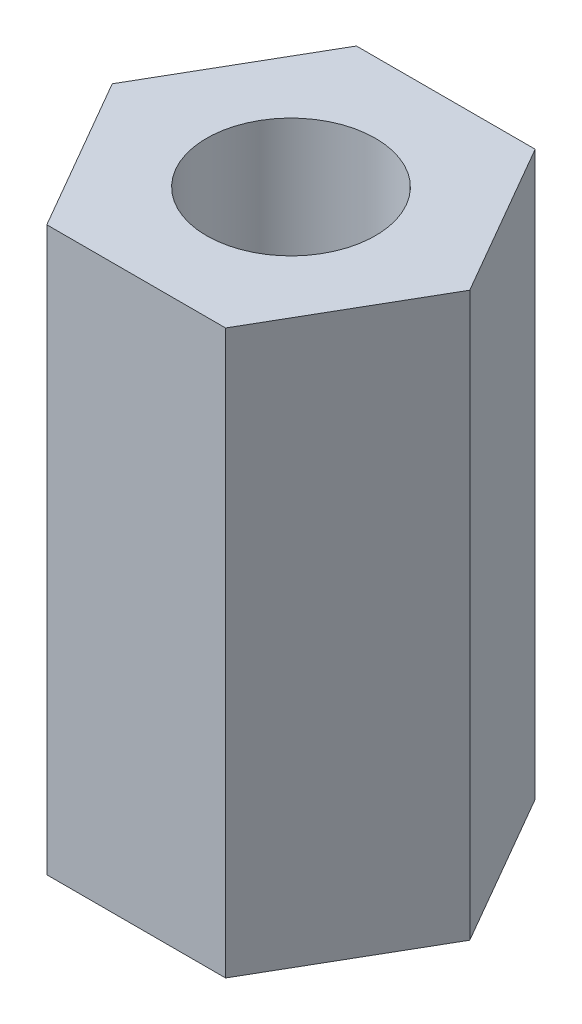
ISO-10303-21;
HEADER;
FILE_DESCRIPTION(('STEP AP214'),'2;1');
FILE_NAME('part.step','',(''),(''),'','','');
FILE_SCHEMA(('AUTOMOTIVE_DESIGN { 1 0 10303 214 1 1 1 1 }'));
ENDSEC;
DATA;
#1=APPLICATION_CONTEXT('core data for automotive mechanical design processes');
#2=APPLICATION_PROTOCOL_DEFINITION('international standard','automotive_design',2000,#1);
#3=PRODUCT_CONTEXT('',#1,'mechanical');
#4=PRODUCT('Part','Part','',(#3));
#5=PRODUCT_RELATED_PRODUCT_CATEGORY('part','',(#4));
#6=PRODUCT_DEFINITION_FORMATION('','',#4);
#7=PRODUCT_DEFINITION_CONTEXT('part definition',#1,'design');
#8=PRODUCT_DEFINITION('design','',#6,#7);
#9=PRODUCT_DEFINITION_SHAPE('','',#8);
#10=(LENGTH_UNIT() NAMED_UNIT(*) SI_UNIT(.MILLI.,.METRE.));
#11=(NAMED_UNIT(*) PLANE_ANGLE_UNIT() SI_UNIT($,.RADIAN.));
#12=(NAMED_UNIT(*) SI_UNIT($,.STERADIAN.) SOLID_ANGLE_UNIT());
#13=UNCERTAINTY_MEASURE_WITH_UNIT(LENGTH_MEASURE(1.E-05),#10,'distance_accuracy_value','');
#14=(GEOMETRIC_REPRESENTATION_CONTEXT(3) GLOBAL_UNCERTAINTY_ASSIGNED_CONTEXT((#13)) GLOBAL_UNIT_ASSIGNED_CONTEXT((#10,
#11,#12)) REPRESENTATION_CONTEXT('',''));
#15=CARTESIAN_POINT('',(0.,0.,0.));
#16=DIRECTION('',(0.,0.,1.));
#17=DIRECTION('',(1.,0.,0.));
#18=AXIS2_PLACEMENT_3D('',#15,#16,#17);
#19=CARTESIAN_POINT('',(0.,10.,0.));
#20=DIRECTION('',(0.,1.,0.));
#21=DIRECTION('',(0.,0.,1.));
#22=AXIS2_PLACEMENT_3D('',#19,#20,#21);
#23=PLANE('',#22);
#24=DIRECTION('',(0.499999999999995,0.,-0.866025403784442));
#25=VECTOR('',#24,1.);
#26=CARTESIAN_POINT('',(1.26770902130206,10.,2.74999999999998));
#27=LINE('',#26,#25);
#28=CARTESIAN_POINT('',(1.26770902130206,10.,2.74999999999998));
#29=VERTEX_POINT('',#28);
#30=CARTESIAN_POINT('',(2.8554222615735,10.,0.));
#31=VERTEX_POINT('',#30);
#32=EDGE_CURVE('E148',#29,#31,#27,.T.);
#33=ORIENTED_EDGE('',*,*,#32,.T.);
#34=DIRECTION('',(-0.500000000000001,0.,-0.866025403784438));
#35=VECTOR('',#34,1.);
#36=CARTESIAN_POINT('',(2.8554222615735,10.,0.));
#37=LINE('',#36,#35);
#38=CARTESIAN_POINT('',(1.26770902130203,10.,-2.75000000000001));
#39=VERTEX_POINT('',#38);
#40=EDGE_CURVE('E96',#31,#39,#37,.T.);
#41=ORIENTED_EDGE('',*,*,#40,.T.);
#42=DIRECTION('',(-1.,0.,0.));
#43=VECTOR('',#42,1.);
#44=CARTESIAN_POINT('',(1.26770902130203,10.,-2.75000000000001));
#45=LINE('',#44,#43);
#46=CARTESIAN_POINT('',(-1.90771745924092,10.,-2.74999999999999));
#47=VERTEX_POINT('',#46);
#48=EDGE_CURVE('E109',#39,#47,#45,.T.);
#49=ORIENTED_EDGE('',*,*,#48,.T.);
#50=DIRECTION('',(-0.499999999999995,0.,0.866025403784441));
#51=VECTOR('',#50,1.);
#52=CARTESIAN_POINT('',(-1.90771745924092,10.,-2.74999999999999));
#53=LINE('',#52,#51);
#54=CARTESIAN_POINT('',(-3.49543069951238,10.,0.));
#55=VERTEX_POINT('',#54);
#56=EDGE_CURVE('E103',#47,#55,#53,.T.);
#57=ORIENTED_EDGE('',*,*,#56,.T.);
#58=DIRECTION('',(0.500000000000007,0.,0.866025403784435));
#59=VECTOR('',#58,1.);
#60=CARTESIAN_POINT('',(-3.49543069951238,10.,0.));
#61=LINE('',#60,#59);
#62=CARTESIAN_POINT('',(-1.90771745924089,10.,2.75000000000002));
#63=VERTEX_POINT('',#62);
#64=EDGE_CURVE('E107',#55,#63,#61,.T.);
#65=ORIENTED_EDGE('',*,*,#64,.T.);
#66=DIRECTION('',(1.,0.,0.));
#67=VECTOR('',#66,1.);
#68=CARTESIAN_POINT('',(-1.90771745924089,10.,2.75000000000002));
#69=LINE('',#68,#67);
#70=EDGE_CURVE('E59',#63,#29,#69,.T.);
#71=ORIENTED_EDGE('',*,*,#70,.T.);
#72=EDGE_LOOP('',(#33,#41,#49,#57,#65,#71));
#73=FACE_BOUND('',#72,.T.);
#74=CARTESIAN_POINT('',(-0.32000421896944,10.,0.));
#75=DIRECTION('',(0.,1.,0.));
#76=DIRECTION('',(0.,0.,1.));
#77=AXIS2_PLACEMENT_3D('',#74,#75,#76);
#78=CIRCLE('',#77,1.5);
#79=CARTESIAN_POINT('',(-0.32000421896944,10.,1.5));
#80=VERTEX_POINT('',#79);
#81=EDGE_CURVE('E136',#80,#80,#78,.T.);
#82=ORIENTED_EDGE('',*,*,#81,.F.);
#83=EDGE_LOOP('',(#82));
#84=FACE_BOUND('',#83,.T.);
#85=ADVANCED_FACE('F41',(#73,#84),#23,.T.);
#86=CARTESIAN_POINT('',(0.,0.,0.));
#87=DIRECTION('',(0.,1.,0.));
#88=DIRECTION('',(0.,0.,1.));
#89=AXIS2_PLACEMENT_3D('',#86,#87,#88);
#90=PLANE('',#89);
#91=DIRECTION('',(0.499999999999995,0.,-0.866025403784442));
#92=VECTOR('',#91,1.);
#93=CARTESIAN_POINT('',(1.26770902130206,0.,2.74999999999998));
#94=LINE('',#93,#92);
#95=CARTESIAN_POINT('',(1.26770902130206,0.,2.74999999999998));
#96=VERTEX_POINT('',#95);
#97=CARTESIAN_POINT('',(2.8554222615735,0.,0.));
#98=VERTEX_POINT('',#97);
#99=EDGE_CURVE('E131',#96,#98,#94,.T.);
#100=ORIENTED_EDGE('',*,*,#99,.F.);
#101=DIRECTION('',(1.,0.,0.));
#102=VECTOR('',#101,1.);
#103=CARTESIAN_POINT('',(-1.90771745924089,0.,2.75000000000002));
#104=LINE('',#103,#102);
#105=CARTESIAN_POINT('',(-1.90771745924089,0.,2.75000000000002));
#106=VERTEX_POINT('',#105);
#107=EDGE_CURVE('E88',#106,#96,#104,.T.);
#108=ORIENTED_EDGE('',*,*,#107,.F.);
#109=DIRECTION('',(0.500000000000007,0.,0.866025403784435));
#110=VECTOR('',#109,1.);
#111=CARTESIAN_POINT('',(-3.49543069951238,0.,0.));
#112=LINE('',#111,#110);
#113=CARTESIAN_POINT('',(-3.49543069951238,0.,0.));
#114=VERTEX_POINT('',#113);
#115=EDGE_CURVE('E82',#114,#106,#112,.T.);
#116=ORIENTED_EDGE('',*,*,#115,.F.);
#117=DIRECTION('',(-0.499999999999995,0.,0.866025403784441));
#118=VECTOR('',#117,1.);
#119=CARTESIAN_POINT('',(-1.90771745924092,0.,-2.74999999999999));
#120=LINE('',#119,#118);
#121=CARTESIAN_POINT('',(-1.90771745924092,0.,-2.74999999999999));
#122=VERTEX_POINT('',#121);
#123=EDGE_CURVE('E118',#122,#114,#120,.T.);
#124=ORIENTED_EDGE('',*,*,#123,.F.);
#125=DIRECTION('',(-1.,0.,0.));
#126=VECTOR('',#125,1.);
#127=CARTESIAN_POINT('',(1.26770902130203,0.,-2.75000000000001));
#128=LINE('',#127,#126);
#129=CARTESIAN_POINT('',(1.26770902130203,0.,-2.75000000000001));
#130=VERTEX_POINT('',#129);
#131=EDGE_CURVE('E139',#130,#122,#128,.T.);
#132=ORIENTED_EDGE('',*,*,#131,.F.);
#133=DIRECTION('',(-0.500000000000001,0.,-0.866025403784438));
#134=VECTOR('',#133,1.);
#135=CARTESIAN_POINT('',(2.8554222615735,0.,0.));
#136=LINE('',#135,#134);
#137=EDGE_CURVE('E135',#98,#130,#136,.T.);
#138=ORIENTED_EDGE('',*,*,#137,.F.);
#139=EDGE_LOOP('',(#100,#108,#116,#124,#132,#138));
#140=FACE_BOUND('',#139,.T.);
#141=CARTESIAN_POINT('',(-0.32000421896944,0.,0.));
#142=DIRECTION('',(0.,1.,0.));
#143=DIRECTION('',(0.,0.,1.));
#144=AXIS2_PLACEMENT_3D('',#141,#142,#143);
#145=CIRCLE('',#144,1.5);
#146=CARTESIAN_POINT('',(-0.32000421896944,0.,1.5));
#147=VERTEX_POINT('',#146);
#148=EDGE_CURVE('E245',#147,#147,#145,.T.);
#149=ORIENTED_EDGE('',*,*,#148,.T.);
#150=EDGE_LOOP('',(#149));
#151=FACE_BOUND('',#150,.T.);
#152=ADVANCED_FACE('F161',(#140,#151),#90,.F.);
#153=CARTESIAN_POINT('',(1.26770902130206,10.,2.74999999999998));
#154=DIRECTION('',(-0.866025403784442,0.,-0.499999999999995));
#155=DIRECTION('',(-0.499999999999995,0.,0.866025403784442));
#156=AXIS2_PLACEMENT_3D('',#153,#154,#155);
#157=PLANE('',#156);
#158=ORIENTED_EDGE('',*,*,#99,.T.);
#159=DIRECTION('',(0.,-1.,0.));
#160=VECTOR('',#159,1.);
#161=CARTESIAN_POINT('',(2.8554222615735,10.,0.));
#162=LINE('',#161,#160);
#163=EDGE_CURVE('E11',#31,#98,#162,.T.);
#164=ORIENTED_EDGE('',*,*,#163,.F.);
#165=ORIENTED_EDGE('',*,*,#32,.F.);
#166=DIRECTION('',(0.,-1.,0.));
#167=VECTOR('',#166,1.);
#168=CARTESIAN_POINT('',(1.26770902130206,10.,2.74999999999998));
#169=LINE('',#168,#167);
#170=EDGE_CURVE('E127',#29,#96,#169,.T.);
#171=ORIENTED_EDGE('',*,*,#170,.T.);
#172=EDGE_LOOP('',(#158,#164,#165,#171));
#173=FACE_BOUND('',#172,.T.);
#174=ADVANCED_FACE('F43',(#173),#157,.F.);
#175=CARTESIAN_POINT('',(2.8554222615735,10.,0.));
#176=DIRECTION('',(-0.866025403784438,0.,0.500000000000001));
#177=DIRECTION('',(0.500000000000001,0.,0.866025403784438));
#178=AXIS2_PLACEMENT_3D('',#175,#176,#177);
#179=PLANE('',#178);
#180=ORIENTED_EDGE('',*,*,#137,.T.);
#181=DIRECTION('',(0.,-1.,0.));
#182=VECTOR('',#181,1.);
#183=CARTESIAN_POINT('',(1.26770902130203,10.,-2.75000000000001));
#184=LINE('',#183,#182);
#185=EDGE_CURVE('E51',#39,#130,#184,.T.);
#186=ORIENTED_EDGE('',*,*,#185,.F.);
#187=ORIENTED_EDGE('',*,*,#40,.F.);
#188=ORIENTED_EDGE('',*,*,#163,.T.);
#189=EDGE_LOOP('',(#180,#186,#187,#188));
#190=FACE_BOUND('',#189,.T.);
#191=ADVANCED_FACE('F186',(#190),#179,.F.);
#192=CARTESIAN_POINT('',(1.26770902130203,10.,-2.75000000000001));
#193=DIRECTION('',(0.,0.,1.));
#194=DIRECTION('',(1.,0.,0.));
#195=AXIS2_PLACEMENT_3D('',#192,#193,#194);
#196=PLANE('',#195);
#197=ORIENTED_EDGE('',*,*,#131,.T.);
#198=DIRECTION('',(0.,-1.,0.));
#199=VECTOR('',#198,1.);
#200=CARTESIAN_POINT('',(-1.90771745924092,10.,-2.74999999999999));
#201=LINE('',#200,#199);
#202=EDGE_CURVE('E120',#47,#122,#201,.T.);
#203=ORIENTED_EDGE('',*,*,#202,.F.);
#204=ORIENTED_EDGE('',*,*,#48,.F.);
#205=ORIENTED_EDGE('',*,*,#185,.T.);
#206=EDGE_LOOP('',(#197,#203,#204,#205));
#207=FACE_BOUND('',#206,.T.);
#208=ADVANCED_FACE('F158',(#207),#196,.F.);
#209=CARTESIAN_POINT('',(-1.90771745924092,10.,-2.74999999999999));
#210=DIRECTION('',(0.866025403784442,0.,0.499999999999995));
#211=DIRECTION('',(0.499999999999995,0.,-0.866025403784442));
#212=AXIS2_PLACEMENT_3D('',#209,#210,#211);
#213=PLANE('',#212);
#214=ORIENTED_EDGE('',*,*,#123,.T.);
#215=DIRECTION('',(0.,-1.,0.));
#216=VECTOR('',#215,1.);
#217=CARTESIAN_POINT('',(-3.49543069951238,10.,0.));
#218=LINE('',#217,#216);
#219=EDGE_CURVE('E115',#55,#114,#218,.T.);
#220=ORIENTED_EDGE('',*,*,#219,.F.);
#221=ORIENTED_EDGE('',*,*,#56,.F.);
#222=ORIENTED_EDGE('',*,*,#202,.T.);
#223=EDGE_LOOP('',(#214,#220,#221,#222));
#224=FACE_BOUND('',#223,.T.);
#225=ADVANCED_FACE('F116',(#224),#213,.F.);
#226=CARTESIAN_POINT('',(-3.49543069951238,10.,0.));
#227=DIRECTION('',(0.866025403784435,0.,-0.500000000000007));
#228=DIRECTION('',(-0.500000000000007,0.,-0.866025403784435));
#229=AXIS2_PLACEMENT_3D('',#226,#227,#228);
#230=PLANE('',#229);
#231=ORIENTED_EDGE('',*,*,#115,.T.);
#232=DIRECTION('',(0.,-1.,0.));
#233=VECTOR('',#232,1.);
#234=CARTESIAN_POINT('',(-1.90771745924089,10.,2.75000000000002));
#235=LINE('',#234,#233);
#236=EDGE_CURVE('E121',#63,#106,#235,.T.);
#237=ORIENTED_EDGE('',*,*,#236,.F.);
#238=ORIENTED_EDGE('',*,*,#64,.F.);
#239=ORIENTED_EDGE('',*,*,#219,.T.);
#240=EDGE_LOOP('',(#231,#237,#238,#239));
#241=FACE_BOUND('',#240,.T.);
#242=ADVANCED_FACE('F123',(#241),#230,.F.);
#243=CARTESIAN_POINT('',(-1.90771745924089,10.,2.75000000000002));
#244=DIRECTION('',(0.,0.,-1.));
#245=DIRECTION('',(-1.,0.,0.));
#246=AXIS2_PLACEMENT_3D('',#243,#244,#245);
#247=PLANE('',#246);
#248=ORIENTED_EDGE('',*,*,#107,.T.);
#249=ORIENTED_EDGE('',*,*,#170,.F.);
#250=ORIENTED_EDGE('',*,*,#70,.F.);
#251=ORIENTED_EDGE('',*,*,#236,.T.);
#252=EDGE_LOOP('',(#248,#249,#250,#251));
#253=FACE_BOUND('',#252,.T.);
#254=ADVANCED_FACE('F166',(#253),#247,.F.);
#255=CARTESIAN_POINT('',(-0.32000421896944,10.,0.));
#256=DIRECTION('',(0.,-1.,0.));
#257=DIRECTION('',(0.,0.,-1.));
#258=AXIS2_PLACEMENT_3D('',#255,#256,#257);
#259=CYLINDRICAL_SURFACE('',#258,1.5);
#260=ORIENTED_EDGE('',*,*,#81,.T.);
#261=EDGE_LOOP('',(#260));
#262=FACE_BOUND('',#261,.T.);
#263=ORIENTED_EDGE('',*,*,#148,.F.);
#264=EDGE_LOOP('',(#263));
#265=FACE_BOUND('',#264,.T.);
#266=ADVANCED_FACE('F168',(#262,#265),#259,.F.);
#267=CLOSED_SHELL('',(#85,#152,#174,#191,#208,#225,#242,#254,#266));
#268=MANIFOLD_SOLID_BREP('B2',#267);
#269=ADVANCED_BREP_SHAPE_REPRESENTATION('',(#18,#268),#14);
#270=SHAPE_DEFINITION_REPRESENTATION(#9,#269);
ENDSEC;
END-ISO-10303-21;
